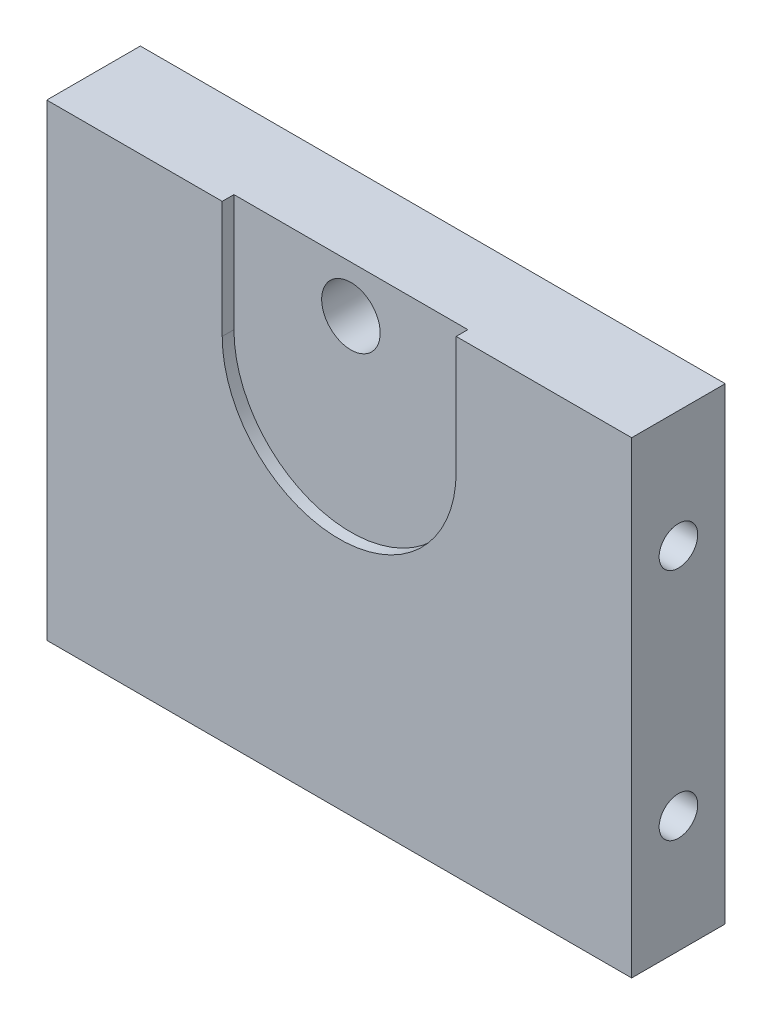
ISO-10303-21;
HEADER;
FILE_DESCRIPTION(('STEP AP214'),'2;1');
FILE_NAME('part.step','',(''),(''),'','','');
FILE_SCHEMA(('AUTOMOTIVE_DESIGN { 1 0 10303 214 1 1 1 1 }'));
ENDSEC;
DATA;
#1=APPLICATION_CONTEXT('core data for automotive mechanical design processes');
#2=APPLICATION_PROTOCOL_DEFINITION('international standard','automotive_design',2000,#1);
#3=PRODUCT_CONTEXT('',#1,'mechanical');
#4=PRODUCT('Part','Part','',(#3));
#5=PRODUCT_RELATED_PRODUCT_CATEGORY('part','',(#4));
#6=PRODUCT_DEFINITION_FORMATION('','',#4);
#7=PRODUCT_DEFINITION_CONTEXT('part definition',#1,'design');
#8=PRODUCT_DEFINITION('design','',#6,#7);
#9=PRODUCT_DEFINITION_SHAPE('','',#8);
#10=(LENGTH_UNIT() NAMED_UNIT(*) SI_UNIT(.MILLI.,.METRE.));
#11=(NAMED_UNIT(*) PLANE_ANGLE_UNIT() SI_UNIT($,.RADIAN.));
#12=(NAMED_UNIT(*) SI_UNIT($,.STERADIAN.) SOLID_ANGLE_UNIT());
#13=UNCERTAINTY_MEASURE_WITH_UNIT(LENGTH_MEASURE(1.E-05),#10,'distance_accuracy_value','');
#14=(GEOMETRIC_REPRESENTATION_CONTEXT(3) GLOBAL_UNCERTAINTY_ASSIGNED_CONTEXT((#13)) GLOBAL_UNIT_ASSIGNED_CONTEXT((#10,
#11,#12)) REPRESENTATION_CONTEXT('',''));
#15=CARTESIAN_POINT('',(0.,0.,0.));
#16=DIRECTION('',(0.,0.,1.));
#17=DIRECTION('',(1.,0.,0.));
#18=AXIS2_PLACEMENT_3D('',#15,#16,#17);
#19=CARTESIAN_POINT('',(25.,20.,8.));
#20=DIRECTION('',(-1.,0.,0.));
#21=DIRECTION('',(0.,-1.,0.));
#22=AXIS2_PLACEMENT_3D('',#19,#20,#21);
#23=PLANE('',#22);
#24=CARTESIAN_POINT('',(25.,-10.,4.));
#25=DIRECTION('',(1.,0.,0.));
#26=DIRECTION('',(0.,1.,0.));
#27=AXIS2_PLACEMENT_3D('',#24,#25,#26);
#28=CIRCLE('',#27,1.65);
#29=CARTESIAN_POINT('',(25.,-8.35,4.));
#30=VERTEX_POINT('',#29);
#31=EDGE_CURVE('E141',#30,#30,#28,.T.);
#32=ORIENTED_EDGE('',*,*,#31,.F.);
#33=EDGE_LOOP('',(#32));
#34=FACE_BOUND('',#33,.T.);
#35=CARTESIAN_POINT('',(25.,9.99999999999999,4.));
#36=DIRECTION('',(1.,0.,0.));
#37=DIRECTION('',(0.,1.,0.));
#38=AXIS2_PLACEMENT_3D('',#35,#36,#37);
#39=CIRCLE('',#38,1.65);
#40=CARTESIAN_POINT('',(25.,11.65,4.));
#41=VERTEX_POINT('',#40);
#42=EDGE_CURVE('E148',#41,#41,#39,.T.);
#43=ORIENTED_EDGE('',*,*,#42,.F.);
#44=EDGE_LOOP('',(#43));
#45=FACE_BOUND('',#44,.T.);
#46=DIRECTION('',(0.,1.,0.));
#47=VECTOR('',#46,1.);
#48=CARTESIAN_POINT('',(25.,20.,0.));
#49=LINE('',#48,#47);
#50=CARTESIAN_POINT('',(25.,-20.,0.));
#51=VERTEX_POINT('',#50);
#52=CARTESIAN_POINT('',(25.,20.,0.));
#53=VERTEX_POINT('',#52);
#54=EDGE_CURVE('E154',#51,#53,#49,.T.);
#55=ORIENTED_EDGE('',*,*,#54,.T.);
#56=DIRECTION('',(0.,0.,-1.));
#57=VECTOR('',#56,1.);
#58=CARTESIAN_POINT('',(25.,20.,8.));
#59=LINE('',#58,#57);
#60=CARTESIAN_POINT('',(25.,20.,8.));
#61=VERTEX_POINT('',#60);
#62=EDGE_CURVE('E11',#61,#53,#59,.T.);
#63=ORIENTED_EDGE('',*,*,#62,.F.);
#64=DIRECTION('',(0.,1.,0.));
#65=VECTOR('',#64,1.);
#66=CARTESIAN_POINT('',(25.,20.,8.));
#67=LINE('',#66,#65);
#68=CARTESIAN_POINT('',(25.,-20.,8.));
#69=VERTEX_POINT('',#68);
#70=EDGE_CURVE('E157',#69,#61,#67,.T.);
#71=ORIENTED_EDGE('',*,*,#70,.F.);
#72=DIRECTION('',(0.,0.,-1.));
#73=VECTOR('',#72,1.);
#74=CARTESIAN_POINT('',(25.,-20.,8.));
#75=LINE('',#74,#73);
#76=EDGE_CURVE('E164',#69,#51,#75,.T.);
#77=ORIENTED_EDGE('',*,*,#76,.T.);
#78=EDGE_LOOP('',(#55,#63,#71,#77));
#79=FACE_BOUND('',#78,.T.);
#80=ADVANCED_FACE('F33',(#34,#45,#79),#23,.F.);
#81=CARTESIAN_POINT('',(-25.,20.,8.));
#82=DIRECTION('',(0.,-1.,0.));
#83=DIRECTION('',(0.,0.,-1.));
#84=AXIS2_PLACEMENT_3D('',#81,#82,#83);
#85=PLANE('',#84);
#86=DIRECTION('',(-1.,0.,0.));
#87=VECTOR('',#86,1.);
#88=CARTESIAN_POINT('',(-25.,20.,8.));
#89=LINE('',#88,#87);
#90=CARTESIAN_POINT('',(-10.,20.,8.));
#91=VERTEX_POINT('',#90);
#92=CARTESIAN_POINT('',(-25.,20.,8.));
#93=VERTEX_POINT('',#92);
#94=EDGE_CURVE('E159',#91,#93,#89,.T.);
#95=ORIENTED_EDGE('',*,*,#94,.F.);
#96=DIRECTION('',(0.,0.,1.));
#97=VECTOR('',#96,1.);
#98=CARTESIAN_POINT('',(-10.,20.,7.));
#99=LINE('',#98,#97);
#100=CARTESIAN_POINT('',(-10.,20.,7.));
#101=VERTEX_POINT('',#100);
#102=EDGE_CURVE('E139',#101,#91,#99,.T.);
#103=ORIENTED_EDGE('',*,*,#102,.F.);
#104=DIRECTION('',(-1.,0.,0.));
#105=VECTOR('',#104,1.);
#106=CARTESIAN_POINT('',(-10.,20.,7.));
#107=LINE('',#106,#105);
#108=CARTESIAN_POINT('',(9.99999999999999,20.,7.));
#109=VERTEX_POINT('',#108);
#110=EDGE_CURVE('E114',#109,#101,#107,.T.);
#111=ORIENTED_EDGE('',*,*,#110,.F.);
#112=DIRECTION('',(0.,0.,1.));
#113=VECTOR('',#112,1.);
#114=CARTESIAN_POINT('',(9.99999999999999,20.,7.));
#115=LINE('',#114,#113);
#116=CARTESIAN_POINT('',(9.99999999999999,20.,8.));
#117=VERTEX_POINT('',#116);
#118=EDGE_CURVE('E142',#109,#117,#115,.T.);
#119=ORIENTED_EDGE('',*,*,#118,.T.);
#120=EDGE_CURVE('E84',#61,#117,#89,.T.);
#121=ORIENTED_EDGE('',*,*,#120,.F.);
#122=ORIENTED_EDGE('',*,*,#62,.T.);
#123=DIRECTION('',(-1.,0.,0.));
#124=VECTOR('',#123,1.);
#125=CARTESIAN_POINT('',(-25.,20.,0.));
#126=LINE('',#125,#124);
#127=CARTESIAN_POINT('',(-25.,20.,0.));
#128=VERTEX_POINT('',#127);
#129=EDGE_CURVE('E167',#53,#128,#126,.T.);
#130=ORIENTED_EDGE('',*,*,#129,.T.);
#131=DIRECTION('',(0.,0.,-1.));
#132=VECTOR('',#131,1.);
#133=CARTESIAN_POINT('',(-25.,20.,8.));
#134=LINE('',#133,#132);
#135=EDGE_CURVE('E40',#93,#128,#134,.T.);
#136=ORIENTED_EDGE('',*,*,#135,.F.);
#137=EDGE_LOOP('',(#95,#103,#111,#119,#121,#122,#130,#136));
#138=FACE_BOUND('',#137,.T.);
#139=ADVANCED_FACE('F198',(#138),#85,.F.);
#140=CARTESIAN_POINT('',(-25.,20.,8.));
#141=DIRECTION('',(1.,0.,0.));
#142=DIRECTION('',(0.,1.,0.));
#143=AXIS2_PLACEMENT_3D('',#140,#141,#142);
#144=PLANE('',#143);
#145=DIRECTION('',(0.,-1.,0.));
#146=VECTOR('',#145,1.);
#147=CARTESIAN_POINT('',(-25.,20.,0.));
#148=LINE('',#147,#146);
#149=CARTESIAN_POINT('',(-25.,-20.,0.));
#150=VERTEX_POINT('',#149);
#151=EDGE_CURVE('E169',#128,#150,#148,.T.);
#152=ORIENTED_EDGE('',*,*,#151,.T.);
#153=DIRECTION('',(0.,0.,-1.));
#154=VECTOR('',#153,1.);
#155=CARTESIAN_POINT('',(-25.,-20.,8.));
#156=LINE('',#155,#154);
#157=CARTESIAN_POINT('',(-25.,-20.,8.));
#158=VERTEX_POINT('',#157);
#159=EDGE_CURVE('E173',#158,#150,#156,.T.);
#160=ORIENTED_EDGE('',*,*,#159,.F.);
#161=DIRECTION('',(0.,-1.,0.));
#162=VECTOR('',#161,1.);
#163=CARTESIAN_POINT('',(-25.,20.,8.));
#164=LINE('',#163,#162);
#165=EDGE_CURVE('E161',#93,#158,#164,.T.);
#166=ORIENTED_EDGE('',*,*,#165,.F.);
#167=ORIENTED_EDGE('',*,*,#135,.T.);
#168=EDGE_LOOP('',(#152,#160,#166,#167));
#169=FACE_BOUND('',#168,.T.);
#170=ADVANCED_FACE('F179',(#169),#144,.F.);
#171=CARTESIAN_POINT('',(-25.,-20.,8.));
#172=DIRECTION('',(0.,1.,0.));
#173=DIRECTION('',(0.,0.,1.));
#174=AXIS2_PLACEMENT_3D('',#171,#172,#173);
#175=PLANE('',#174);
#176=DIRECTION('',(1.,0.,0.));
#177=VECTOR('',#176,1.);
#178=CARTESIAN_POINT('',(-25.,-20.,0.));
#179=LINE('',#178,#177);
#180=EDGE_CURVE('E77',#150,#51,#179,.T.);
#181=ORIENTED_EDGE('',*,*,#180,.T.);
#182=ORIENTED_EDGE('',*,*,#76,.F.);
#183=DIRECTION('',(1.,0.,0.));
#184=VECTOR('',#183,1.);
#185=CARTESIAN_POINT('',(-25.,-20.,8.));
#186=LINE('',#185,#184);
#187=EDGE_CURVE('E56',#158,#69,#186,.T.);
#188=ORIENTED_EDGE('',*,*,#187,.F.);
#189=ORIENTED_EDGE('',*,*,#159,.T.);
#190=EDGE_LOOP('',(#181,#182,#188,#189));
#191=FACE_BOUND('',#190,.T.);
#192=ADVANCED_FACE('F188',(#191),#175,.F.);
#193=CARTESIAN_POINT('',(0.,0.,8.));
#194=DIRECTION('',(0.,0.,1.));
#195=DIRECTION('',(1.,0.,0.));
#196=AXIS2_PLACEMENT_3D('',#193,#194,#195);
#197=PLANE('',#196);
#198=DIRECTION('',(0.,-1.,0.));
#199=VECTOR('',#198,1.);
#200=CARTESIAN_POINT('',(-10.,20.,8.));
#201=LINE('',#200,#199);
#202=CARTESIAN_POINT('',(-10.,10.,8.));
#203=VERTEX_POINT('',#202);
#204=EDGE_CURVE('E47',#91,#203,#201,.T.);
#205=ORIENTED_EDGE('',*,*,#204,.F.);
#206=ORIENTED_EDGE('',*,*,#94,.T.);
#207=ORIENTED_EDGE('',*,*,#165,.T.);
#208=ORIENTED_EDGE('',*,*,#187,.T.);
#209=ORIENTED_EDGE('',*,*,#70,.T.);
#210=ORIENTED_EDGE('',*,*,#120,.T.);
#211=DIRECTION('',(0.,1.,0.));
#212=VECTOR('',#211,1.);
#213=CARTESIAN_POINT('',(9.99999999999999,20.,8.));
#214=LINE('',#213,#212);
#215=CARTESIAN_POINT('',(9.99999999999999,10.,8.));
#216=VERTEX_POINT('',#215);
#217=EDGE_CURVE('E127',#216,#117,#214,.T.);
#218=ORIENTED_EDGE('',*,*,#217,.F.);
#219=CARTESIAN_POINT('',(0.,9.99999999999999,8.));
#220=DIRECTION('',(0.,0.,1.));
#221=DIRECTION('',(1.,0.,0.));
#222=AXIS2_PLACEMENT_3D('',#219,#220,#221);
#223=CIRCLE('',#222,10.);
#224=EDGE_CURVE('E129',#203,#216,#223,.T.);
#225=ORIENTED_EDGE('',*,*,#224,.F.);
#226=EDGE_LOOP('',(#205,#206,#207,#208,#209,#210,#218,#225));
#227=FACE_BOUND('',#226,.T.);
#228=ADVANCED_FACE('F190',(#227),#197,.T.);
#229=CARTESIAN_POINT('',(0.,0.,0.));
#230=DIRECTION('',(0.,0.,1.));
#231=DIRECTION('',(1.,0.,0.));
#232=AXIS2_PLACEMENT_3D('',#229,#230,#231);
#233=PLANE('',#232);
#234=CARTESIAN_POINT('',(0.,16.,0.));
#235=DIRECTION('',(0.,0.,1.));
#236=DIRECTION('',(1.,0.,0.));
#237=AXIS2_PLACEMENT_3D('',#234,#235,#236);
#238=CIRCLE('',#237,2.5);
#239=CARTESIAN_POINT('',(2.5,16.,0.));
#240=VERTEX_POINT('',#239);
#241=EDGE_CURVE('E132',#240,#240,#238,.T.);
#242=ORIENTED_EDGE('',*,*,#241,.T.);
#243=EDGE_LOOP('',(#242));
#244=FACE_BOUND('',#243,.T.);
#245=ORIENTED_EDGE('',*,*,#54,.F.);
#246=ORIENTED_EDGE('',*,*,#180,.F.);
#247=ORIENTED_EDGE('',*,*,#151,.F.);
#248=ORIENTED_EDGE('',*,*,#129,.F.);
#249=EDGE_LOOP('',(#245,#246,#247,#248));
#250=FACE_BOUND('',#249,.T.);
#251=ADVANCED_FACE('F184',(#244,#250),#233,.F.);
#252=CARTESIAN_POINT('',(10.,9.99999999999999,4.));
#253=DIRECTION('',(1.,0.,0.));
#254=DIRECTION('',(0.,1.,0.));
#255=AXIS2_PLACEMENT_3D('',#252,#253,#254);
#256=CYLINDRICAL_SURFACE('',#255,1.65);
#257=CARTESIAN_POINT('',(10.,9.99999999999999,4.));
#258=DIRECTION('',(1.,0.,0.));
#259=DIRECTION('',(0.,1.,0.));
#260=AXIS2_PLACEMENT_3D('',#257,#258,#259);
#261=CIRCLE('',#260,1.65);
#262=CARTESIAN_POINT('',(10.,11.65,4.));
#263=VERTEX_POINT('',#262);
#264=EDGE_CURVE('E151',#263,#263,#261,.T.);
#265=ORIENTED_EDGE('',*,*,#264,.F.);
#266=EDGE_LOOP('',(#265));
#267=FACE_BOUND('',#266,.T.);
#268=ORIENTED_EDGE('',*,*,#42,.T.);
#269=EDGE_LOOP('',(#268));
#270=FACE_BOUND('',#269,.T.);
#271=ADVANCED_FACE('F211',(#267,#270),#256,.F.);
#272=CARTESIAN_POINT('',(10.,9.99999999999999,4.));
#273=DIRECTION('',(1.,0.,0.));
#274=DIRECTION('',(0.,1.,0.));
#275=AXIS2_PLACEMENT_3D('',#272,#273,#274);
#276=PLANE('',#275);
#277=ORIENTED_EDGE('',*,*,#264,.T.);
#278=EDGE_LOOP('',(#277));
#279=FACE_BOUND('',#278,.T.);
#280=ADVANCED_FACE('F213',(#279),#276,.T.);
#281=CARTESIAN_POINT('',(10.,-10.,4.));
#282=DIRECTION('',(1.,0.,0.));
#283=DIRECTION('',(0.,1.,0.));
#284=AXIS2_PLACEMENT_3D('',#281,#282,#283);
#285=CYLINDRICAL_SURFACE('',#284,1.65);
#286=CARTESIAN_POINT('',(10.,-10.,4.));
#287=DIRECTION('',(1.,0.,0.));
#288=DIRECTION('',(0.,1.,0.));
#289=AXIS2_PLACEMENT_3D('',#286,#287,#288);
#290=CIRCLE('',#289,1.65);
#291=CARTESIAN_POINT('',(10.,-8.35000000000001,4.));
#292=VERTEX_POINT('',#291);
#293=EDGE_CURVE('E145',#292,#292,#290,.T.);
#294=ORIENTED_EDGE('',*,*,#293,.F.);
#295=EDGE_LOOP('',(#294));
#296=FACE_BOUND('',#295,.T.);
#297=ORIENTED_EDGE('',*,*,#31,.T.);
#298=EDGE_LOOP('',(#297));
#299=FACE_BOUND('',#298,.T.);
#300=ADVANCED_FACE('F220',(#296,#299),#285,.F.);
#301=CARTESIAN_POINT('',(10.,-10.,4.));
#302=DIRECTION('',(1.,0.,0.));
#303=DIRECTION('',(0.,1.,0.));
#304=AXIS2_PLACEMENT_3D('',#301,#302,#303);
#305=PLANE('',#304);
#306=ORIENTED_EDGE('',*,*,#293,.T.);
#307=EDGE_LOOP('',(#306));
#308=FACE_BOUND('',#307,.T.);
#309=ADVANCED_FACE('F229',(#308),#305,.T.);
#310=CARTESIAN_POINT('',(-10.,20.,7.));
#311=DIRECTION('',(-1.,0.,0.));
#312=DIRECTION('',(0.,-1.,0.));
#313=AXIS2_PLACEMENT_3D('',#310,#311,#312);
#314=PLANE('',#313);
#315=ORIENTED_EDGE('',*,*,#204,.T.);
#316=DIRECTION('',(0.,0.,1.));
#317=VECTOR('',#316,1.);
#318=CARTESIAN_POINT('',(-10.,10.,7.));
#319=LINE('',#318,#317);
#320=CARTESIAN_POINT('',(-10.,10.,7.));
#321=VERTEX_POINT('',#320);
#322=EDGE_CURVE('E104',#321,#203,#319,.T.);
#323=ORIENTED_EDGE('',*,*,#322,.F.);
#324=DIRECTION('',(0.,-1.,0.));
#325=VECTOR('',#324,1.);
#326=CARTESIAN_POINT('',(-10.,20.,7.));
#327=LINE('',#326,#325);
#328=EDGE_CURVE('E108',#101,#321,#327,.T.);
#329=ORIENTED_EDGE('',*,*,#328,.F.);
#330=ORIENTED_EDGE('',*,*,#102,.T.);
#331=EDGE_LOOP('',(#315,#323,#329,#330));
#332=FACE_BOUND('',#331,.T.);
#333=ADVANCED_FACE('F106',(#332),#314,.F.);
#334=CARTESIAN_POINT('',(9.99999999999999,20.,7.));
#335=DIRECTION('',(1.,0.,0.));
#336=DIRECTION('',(0.,1.,0.));
#337=AXIS2_PLACEMENT_3D('',#334,#335,#336);
#338=PLANE('',#337);
#339=ORIENTED_EDGE('',*,*,#217,.T.);
#340=ORIENTED_EDGE('',*,*,#118,.F.);
#341=DIRECTION('',(0.,1.,0.));
#342=VECTOR('',#341,1.);
#343=CARTESIAN_POINT('',(9.99999999999999,20.,7.));
#344=LINE('',#343,#342);
#345=CARTESIAN_POINT('',(9.99999999999999,10.,7.));
#346=VERTEX_POINT('',#345);
#347=EDGE_CURVE('E122',#346,#109,#344,.T.);
#348=ORIENTED_EDGE('',*,*,#347,.F.);
#349=DIRECTION('',(0.,0.,1.));
#350=VECTOR('',#349,1.);
#351=CARTESIAN_POINT('',(9.99999999999999,10.,7.));
#352=LINE('',#351,#350);
#353=EDGE_CURVE('E113',#346,#216,#352,.T.);
#354=ORIENTED_EDGE('',*,*,#353,.T.);
#355=EDGE_LOOP('',(#339,#340,#348,#354));
#356=FACE_BOUND('',#355,.T.);
#357=ADVANCED_FACE('F236',(#356),#338,.F.);
#358=CARTESIAN_POINT('',(0.,9.99999999999999,7.));
#359=DIRECTION('',(0.,0.,1.));
#360=DIRECTION('',(1.,0.,0.));
#361=AXIS2_PLACEMENT_3D('',#358,#359,#360);
#362=CYLINDRICAL_SURFACE('',#361,10.);
#363=ORIENTED_EDGE('',*,*,#224,.T.);
#364=ORIENTED_EDGE('',*,*,#353,.F.);
#365=CARTESIAN_POINT('',(0.,9.99999999999999,7.));
#366=DIRECTION('',(0.,0.,1.));
#367=DIRECTION('',(1.,0.,0.));
#368=AXIS2_PLACEMENT_3D('',#365,#366,#367);
#369=CIRCLE('',#368,10.);
#370=EDGE_CURVE('E117',#321,#346,#369,.T.);
#371=ORIENTED_EDGE('',*,*,#370,.F.);
#372=ORIENTED_EDGE('',*,*,#322,.T.);
#373=EDGE_LOOP('',(#363,#364,#371,#372));
#374=FACE_BOUND('',#373,.T.);
#375=ADVANCED_FACE('F118',(#374),#362,.F.);
#376=CARTESIAN_POINT('',(0.,9.99999999999999,7.));
#377=DIRECTION('',(0.,0.,1.));
#378=DIRECTION('',(1.,0.,0.));
#379=AXIS2_PLACEMENT_3D('',#376,#377,#378);
#380=PLANE('',#379);
#381=CARTESIAN_POINT('',(0.,16.,7.));
#382=DIRECTION('',(0.,0.,1.));
#383=DIRECTION('',(1.,0.,0.));
#384=AXIS2_PLACEMENT_3D('',#381,#382,#383);
#385=CIRCLE('',#384,2.5);
#386=CARTESIAN_POINT('',(2.5,16.,7.));
#387=VERTEX_POINT('',#386);
#388=EDGE_CURVE('E253',#387,#387,#385,.T.);
#389=ORIENTED_EDGE('',*,*,#388,.F.);
#390=EDGE_LOOP('',(#389));
#391=FACE_BOUND('',#390,.T.);
#392=ORIENTED_EDGE('',*,*,#328,.T.);
#393=ORIENTED_EDGE('',*,*,#370,.T.);
#394=ORIENTED_EDGE('',*,*,#347,.T.);
#395=ORIENTED_EDGE('',*,*,#110,.T.);
#396=EDGE_LOOP('',(#392,#393,#394,#395));
#397=FACE_BOUND('',#396,.T.);
#398=ADVANCED_FACE('F124',(#391,#397),#380,.T.);
#399=CARTESIAN_POINT('',(0.,16.,-3.));
#400=DIRECTION('',(0.,0.,1.));
#401=DIRECTION('',(1.,0.,0.));
#402=AXIS2_PLACEMENT_3D('',#399,#400,#401);
#403=CYLINDRICAL_SURFACE('',#402,2.5);
#404=ORIENTED_EDGE('',*,*,#388,.T.);
#405=EDGE_LOOP('',(#404));
#406=FACE_BOUND('',#405,.T.);
#407=ORIENTED_EDGE('',*,*,#241,.F.);
#408=EDGE_LOOP('',(#407));
#409=FACE_BOUND('',#408,.T.);
#410=ADVANCED_FACE('F244',(#406,#409),#403,.F.);
#411=CLOSED_SHELL('',(#80,#139,#170,#192,#228,#251,#271,#280,#300,#309,#333,#357,#375,#398,#410));
#412=MANIFOLD_SOLID_BREP('B2',#411);
#413=ADVANCED_BREP_SHAPE_REPRESENTATION('',(#18,#412),#14);
#414=SHAPE_DEFINITION_REPRESENTATION(#9,#413);
ENDSEC;
END-ISO-10303-21;
